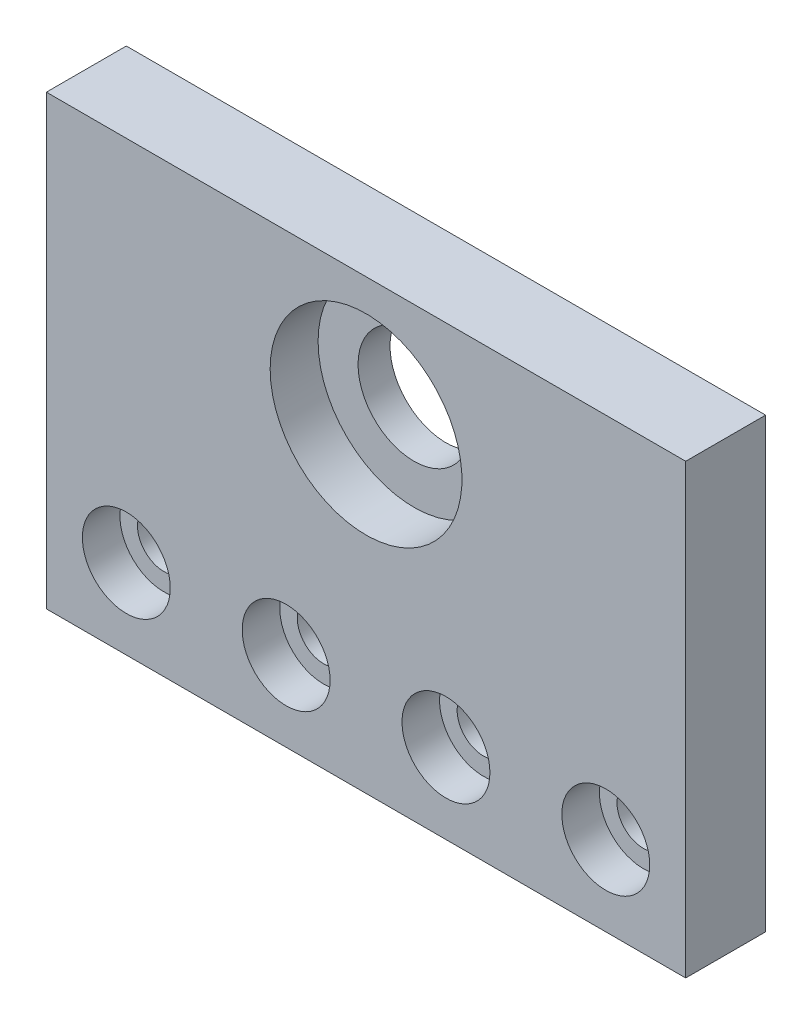
ISO-10303-21;
HEADER;
FILE_DESCRIPTION(('STEP AP214'),'2;1');
FILE_NAME('part.step','',(''),(''),'','','');
FILE_SCHEMA(('AUTOMOTIVE_DESIGN { 1 0 10303 214 1 1 1 1 }'));
ENDSEC;
DATA;
#1=APPLICATION_CONTEXT('core data for automotive mechanical design processes');
#2=APPLICATION_PROTOCOL_DEFINITION('international standard','automotive_design',2000,#1);
#3=PRODUCT_CONTEXT('',#1,'mechanical');
#4=PRODUCT('Part','Part','',(#3));
#5=PRODUCT_RELATED_PRODUCT_CATEGORY('part','',(#4));
#6=PRODUCT_DEFINITION_FORMATION('','',#4);
#7=PRODUCT_DEFINITION_CONTEXT('part definition',#1,'design');
#8=PRODUCT_DEFINITION('design','',#6,#7);
#9=PRODUCT_DEFINITION_SHAPE('','',#8);
#10=(LENGTH_UNIT() NAMED_UNIT(*) SI_UNIT(.MILLI.,.METRE.));
#11=(NAMED_UNIT(*) PLANE_ANGLE_UNIT() SI_UNIT($,.RADIAN.));
#12=(NAMED_UNIT(*) SI_UNIT($,.STERADIAN.) SOLID_ANGLE_UNIT());
#13=UNCERTAINTY_MEASURE_WITH_UNIT(LENGTH_MEASURE(1.E-05),#10,'distance_accuracy_value','');
#14=(GEOMETRIC_REPRESENTATION_CONTEXT(3) GLOBAL_UNCERTAINTY_ASSIGNED_CONTEXT((#13)) GLOBAL_UNIT_ASSIGNED_CONTEXT((#10,
#11,#12)) REPRESENTATION_CONTEXT('',''));
#15=CARTESIAN_POINT('',(0.,0.,0.));
#16=DIRECTION('',(0.,0.,1.));
#17=DIRECTION('',(1.,0.,0.));
#18=AXIS2_PLACEMENT_3D('',#15,#16,#17);
#19=CARTESIAN_POINT('',(0.,0.,0.));
#20=DIRECTION('',(0.,0.,-1.));
#21=DIRECTION('',(-1.,0.,0.));
#22=AXIS2_PLACEMENT_3D('',#19,#20,#21);
#23=PLANE('',#22);
#24=CARTESIAN_POINT('',(0.,0.,0.));
#25=DIRECTION('',(0.,0.,-1.));
#26=DIRECTION('',(-1.,0.,0.));
#27=AXIS2_PLACEMENT_3D('',#24,#25,#26);
#28=CIRCLE('',#27,12.);
#29=CARTESIAN_POINT('',(-12.,0.,0.));
#30=VERTEX_POINT('',#29);
#31=EDGE_CURVE('E231',#30,#30,#28,.T.);
#32=ORIENTED_EDGE('',*,*,#31,.T.);
#33=EDGE_LOOP('',(#32));
#34=FACE_BOUND('',#33,.T.);
#35=CARTESIAN_POINT('',(30.,-30.,0.));
#36=DIRECTION('',(0.,0.,1.));
#37=DIRECTION('',(1.,0.,0.));
#38=AXIS2_PLACEMENT_3D('',#35,#36,#37);
#39=CIRCLE('',#38,5.5);
#40=CARTESIAN_POINT('',(35.5,-30.,0.));
#41=VERTEX_POINT('',#40);
#42=EDGE_CURVE('E240',#41,#41,#39,.T.);
#43=ORIENTED_EDGE('',*,*,#42,.F.);
#44=EDGE_LOOP('',(#43));
#45=FACE_BOUND('',#44,.T.);
#46=CARTESIAN_POINT('',(10.,-30.,0.));
#47=DIRECTION('',(0.,0.,1.));
#48=DIRECTION('',(1.,0.,0.));
#49=AXIS2_PLACEMENT_3D('',#46,#47,#48);
#50=CIRCLE('',#49,5.5);
#51=CARTESIAN_POINT('',(15.5,-30.,0.));
#52=VERTEX_POINT('',#51);
#53=EDGE_CURVE('E252',#52,#52,#50,.T.);
#54=ORIENTED_EDGE('',*,*,#53,.F.);
#55=EDGE_LOOP('',(#54));
#56=FACE_BOUND('',#55,.T.);
#57=CARTESIAN_POINT('',(-9.99999999999999,-30.,0.));
#58=DIRECTION('',(0.,0.,1.));
#59=DIRECTION('',(1.,0.,0.));
#60=AXIS2_PLACEMENT_3D('',#57,#58,#59);
#61=CIRCLE('',#60,5.5);
#62=CARTESIAN_POINT('',(-4.5,-30.,0.));
#63=VERTEX_POINT('',#62);
#64=EDGE_CURVE('E264',#63,#63,#61,.T.);
#65=ORIENTED_EDGE('',*,*,#64,.F.);
#66=EDGE_LOOP('',(#65));
#67=FACE_BOUND('',#66,.T.);
#68=DIRECTION('',(0.,-1.,0.));
#69=VECTOR('',#68,1.);
#70=CARTESIAN_POINT('',(-40.,-40.,0.));
#71=LINE('',#70,#69);
#72=CARTESIAN_POINT('',(-40.,16.,0.));
#73=VERTEX_POINT('',#72);
#74=CARTESIAN_POINT('',(-40.,-40.,0.));
#75=VERTEX_POINT('',#74);
#76=EDGE_CURVE('E111',#73,#75,#71,.T.);
#77=ORIENTED_EDGE('',*,*,#76,.T.);
#78=DIRECTION('',(1.,0.,0.));
#79=VECTOR('',#78,1.);
#80=CARTESIAN_POINT('',(-40.,-40.,0.));
#81=LINE('',#80,#79);
#82=CARTESIAN_POINT('',(40.,-40.,0.));
#83=VERTEX_POINT('',#82);
#84=EDGE_CURVE('E114',#75,#83,#81,.T.);
#85=ORIENTED_EDGE('',*,*,#84,.T.);
#86=DIRECTION('',(0.,1.,0.));
#87=VECTOR('',#86,1.);
#88=CARTESIAN_POINT('',(40.,-40.,0.));
#89=LINE('',#88,#87);
#90=CARTESIAN_POINT('',(40.,16.,0.));
#91=VERTEX_POINT('',#90);
#92=EDGE_CURVE('E95',#83,#91,#89,.T.);
#93=ORIENTED_EDGE('',*,*,#92,.T.);
#94=DIRECTION('',(-1.,0.,0.));
#95=VECTOR('',#94,1.);
#96=CARTESIAN_POINT('',(-40.,16.,0.));
#97=LINE('',#96,#95);
#98=EDGE_CURVE('E106',#91,#73,#97,.T.);
#99=ORIENTED_EDGE('',*,*,#98,.T.);
#100=EDGE_LOOP('',(#77,#85,#93,#99));
#101=FACE_BOUND('',#100,.T.);
#102=CARTESIAN_POINT('',(-30.,-30.,0.));
#103=DIRECTION('',(0.,0.,1.));
#104=DIRECTION('',(1.,0.,0.));
#105=AXIS2_PLACEMENT_3D('',#102,#103,#104);
#106=CIRCLE('',#105,5.5);
#107=CARTESIAN_POINT('',(-24.5,-30.,0.));
#108=VERTEX_POINT('',#107);
#109=EDGE_CURVE('E276',#108,#108,#106,.T.);
#110=ORIENTED_EDGE('',*,*,#109,.F.);
#111=EDGE_LOOP('',(#110));
#112=FACE_BOUND('',#111,.T.);
#113=ADVANCED_FACE('F43',(#34,#45,#56,#67,#101,#112),#23,.F.);
#114=CARTESIAN_POINT('',(-40.,-40.,-10.));
#115=DIRECTION('',(-1.,0.,0.));
#116=DIRECTION('',(0.,0.,1.));
#117=AXIS2_PLACEMENT_3D('',#114,#115,#116);
#118=PLANE('',#117);
#119=ORIENTED_EDGE('',*,*,#76,.F.);
#120=DIRECTION('',(0.,0.,1.));
#121=VECTOR('',#120,1.);
#122=CARTESIAN_POINT('',(-40.,16.,-10.));
#123=LINE('',#122,#121);
#124=CARTESIAN_POINT('',(-40.,16.,-10.));
#125=VERTEX_POINT('',#124);
#126=EDGE_CURVE('E11',#125,#73,#123,.T.);
#127=ORIENTED_EDGE('',*,*,#126,.F.);
#128=DIRECTION('',(0.,-1.,0.));
#129=VECTOR('',#128,1.);
#130=CARTESIAN_POINT('',(-40.,-40.,-10.));
#131=LINE('',#130,#129);
#132=CARTESIAN_POINT('',(-40.,-40.,-10.));
#133=VERTEX_POINT('',#132);
#134=EDGE_CURVE('E104',#125,#133,#131,.T.);
#135=ORIENTED_EDGE('',*,*,#134,.T.);
#136=DIRECTION('',(0.,0.,1.));
#137=VECTOR('',#136,1.);
#138=CARTESIAN_POINT('',(-40.,-40.,-10.));
#139=LINE('',#138,#137);
#140=EDGE_CURVE('E87',#133,#75,#139,.T.);
#141=ORIENTED_EDGE('',*,*,#140,.T.);
#142=EDGE_LOOP('',(#119,#127,#135,#141));
#143=FACE_BOUND('',#142,.T.);
#144=ADVANCED_FACE('F45',(#143),#118,.T.);
#145=CARTESIAN_POINT('',(-40.,16.,-10.));
#146=DIRECTION('',(0.,1.,0.));
#147=DIRECTION('',(0.,0.,1.));
#148=AXIS2_PLACEMENT_3D('',#145,#146,#147);
#149=PLANE('',#148);
#150=ORIENTED_EDGE('',*,*,#98,.F.);
#151=DIRECTION('',(0.,0.,1.));
#152=VECTOR('',#151,1.);
#153=CARTESIAN_POINT('',(40.,16.,-10.));
#154=LINE('',#153,#152);
#155=CARTESIAN_POINT('',(40.,16.,-10.));
#156=VERTEX_POINT('',#155);
#157=EDGE_CURVE('E53',#156,#91,#154,.T.);
#158=ORIENTED_EDGE('',*,*,#157,.F.);
#159=DIRECTION('',(-1.,0.,0.));
#160=VECTOR('',#159,1.);
#161=CARTESIAN_POINT('',(-40.,16.,-10.));
#162=LINE('',#161,#160);
#163=EDGE_CURVE('E101',#156,#125,#162,.T.);
#164=ORIENTED_EDGE('',*,*,#163,.T.);
#165=ORIENTED_EDGE('',*,*,#126,.T.);
#166=EDGE_LOOP('',(#150,#158,#164,#165));
#167=FACE_BOUND('',#166,.T.);
#168=ADVANCED_FACE('F122',(#167),#149,.T.);
#169=CARTESIAN_POINT('',(40.,-40.,-10.));
#170=DIRECTION('',(1.,0.,0.));
#171=DIRECTION('',(0.,0.,-1.));
#172=AXIS2_PLACEMENT_3D('',#169,#170,#171);
#173=PLANE('',#172);
#174=ORIENTED_EDGE('',*,*,#92,.F.);
#175=DIRECTION('',(0.,0.,1.));
#176=VECTOR('',#175,1.);
#177=CARTESIAN_POINT('',(40.,-40.,-10.));
#178=LINE('',#177,#176);
#179=CARTESIAN_POINT('',(40.,-40.,-10.));
#180=VERTEX_POINT('',#179);
#181=EDGE_CURVE('E90',#180,#83,#178,.T.);
#182=ORIENTED_EDGE('',*,*,#181,.F.);
#183=DIRECTION('',(0.,1.,0.));
#184=VECTOR('',#183,1.);
#185=CARTESIAN_POINT('',(40.,-40.,-10.));
#186=LINE('',#185,#184);
#187=EDGE_CURVE('E93',#180,#156,#186,.T.);
#188=ORIENTED_EDGE('',*,*,#187,.T.);
#189=ORIENTED_EDGE('',*,*,#157,.T.);
#190=EDGE_LOOP('',(#174,#182,#188,#189));
#191=FACE_BOUND('',#190,.T.);
#192=ADVANCED_FACE('F92',(#191),#173,.T.);
#193=CARTESIAN_POINT('',(-40.,-40.,-10.));
#194=DIRECTION('',(0.,-1.,0.));
#195=DIRECTION('',(0.,0.,-1.));
#196=AXIS2_PLACEMENT_3D('',#193,#194,#195);
#197=PLANE('',#196);
#198=ORIENTED_EDGE('',*,*,#84,.F.);
#199=ORIENTED_EDGE('',*,*,#140,.F.);
#200=DIRECTION('',(1.,0.,0.));
#201=VECTOR('',#200,1.);
#202=CARTESIAN_POINT('',(-40.,-40.,-10.));
#203=LINE('',#202,#201);
#204=EDGE_CURVE('E100',#133,#180,#203,.T.);
#205=ORIENTED_EDGE('',*,*,#204,.T.);
#206=ORIENTED_EDGE('',*,*,#181,.T.);
#207=EDGE_LOOP('',(#198,#199,#205,#206));
#208=FACE_BOUND('',#207,.T.);
#209=ADVANCED_FACE('F103',(#208),#197,.T.);
#210=CARTESIAN_POINT('',(0.,0.,-10.));
#211=DIRECTION('',(0.,0.,-1.));
#212=DIRECTION('',(-1.,0.,0.));
#213=AXIS2_PLACEMENT_3D('',#210,#211,#212);
#214=PLANE('',#213);
#215=CARTESIAN_POINT('',(30.,0.,-10.));
#216=DIRECTION('',(0.,0.,1.));
#217=DIRECTION('',(1.,0.,0.));
#218=AXIS2_PLACEMENT_3D('',#215,#216,#217);
#219=CIRCLE('',#218,5.);
#220=CARTESIAN_POINT('',(35.,0.,-10.));
#221=VERTEX_POINT('',#220);
#222=EDGE_CURVE('E222',#221,#221,#219,.T.);
#223=ORIENTED_EDGE('',*,*,#222,.T.);
#224=EDGE_LOOP('',(#223));
#225=FACE_BOUND('',#224,.T.);
#226=CARTESIAN_POINT('',(-30.,0.,-10.));
#227=DIRECTION('',(0.,0.,-1.));
#228=DIRECTION('',(-1.,0.,0.));
#229=AXIS2_PLACEMENT_3D('',#226,#227,#228);
#230=CIRCLE('',#229,5.);
#231=CARTESIAN_POINT('',(-35.,0.,-10.));
#232=VERTEX_POINT('',#231);
#233=EDGE_CURVE('E221',#232,#232,#230,.T.);
#234=ORIENTED_EDGE('',*,*,#233,.F.);
#235=EDGE_LOOP('',(#234));
#236=FACE_BOUND('',#235,.T.);
#237=CARTESIAN_POINT('',(0.,0.,-10.));
#238=DIRECTION('',(0.,0.,1.));
#239=DIRECTION('',(1.,0.,0.));
#240=AXIS2_PLACEMENT_3D('',#237,#238,#239);
#241=CIRCLE('',#240,7.);
#242=CARTESIAN_POINT('',(7.,0.,-10.));
#243=VERTEX_POINT('',#242);
#244=EDGE_CURVE('E237',#243,#243,#241,.T.);
#245=ORIENTED_EDGE('',*,*,#244,.T.);
#246=EDGE_LOOP('',(#245));
#247=FACE_BOUND('',#246,.T.);
#248=CARTESIAN_POINT('',(30.,-30.,-10.));
#249=DIRECTION('',(0.,0.,1.));
#250=DIRECTION('',(1.,0.,0.));
#251=AXIS2_PLACEMENT_3D('',#248,#249,#250);
#252=CIRCLE('',#251,3.3);
#253=CARTESIAN_POINT('',(33.3,-30.,-10.));
#254=VERTEX_POINT('',#253);
#255=EDGE_CURVE('E249',#254,#254,#252,.T.);
#256=ORIENTED_EDGE('',*,*,#255,.T.);
#257=EDGE_LOOP('',(#256));
#258=FACE_BOUND('',#257,.T.);
#259=CARTESIAN_POINT('',(10.,-30.,-10.));
#260=DIRECTION('',(0.,0.,1.));
#261=DIRECTION('',(1.,0.,0.));
#262=AXIS2_PLACEMENT_3D('',#259,#260,#261);
#263=CIRCLE('',#262,3.3);
#264=CARTESIAN_POINT('',(13.3,-30.,-10.));
#265=VERTEX_POINT('',#264);
#266=EDGE_CURVE('E261',#265,#265,#263,.T.);
#267=ORIENTED_EDGE('',*,*,#266,.T.);
#268=EDGE_LOOP('',(#267));
#269=FACE_BOUND('',#268,.T.);
#270=CARTESIAN_POINT('',(-9.99999999999999,-30.,-10.));
#271=DIRECTION('',(0.,0.,1.));
#272=DIRECTION('',(1.,0.,0.));
#273=AXIS2_PLACEMENT_3D('',#270,#271,#272);
#274=CIRCLE('',#273,3.3);
#275=CARTESIAN_POINT('',(-6.7,-30.,-10.));
#276=VERTEX_POINT('',#275);
#277=EDGE_CURVE('E273',#276,#276,#274,.T.);
#278=ORIENTED_EDGE('',*,*,#277,.T.);
#279=EDGE_LOOP('',(#278));
#280=FACE_BOUND('',#279,.T.);
#281=CARTESIAN_POINT('',(-30.,-30.,-10.));
#282=DIRECTION('',(0.,0.,1.));
#283=DIRECTION('',(1.,0.,0.));
#284=AXIS2_PLACEMENT_3D('',#281,#282,#283);
#285=CIRCLE('',#284,3.3);
#286=CARTESIAN_POINT('',(-26.7,-30.,-10.));
#287=VERTEX_POINT('',#286);
#288=EDGE_CURVE('E115',#287,#287,#285,.T.);
#289=ORIENTED_EDGE('',*,*,#288,.T.);
#290=EDGE_LOOP('',(#289));
#291=FACE_BOUND('',#290,.T.);
#292=ORIENTED_EDGE('',*,*,#134,.F.);
#293=ORIENTED_EDGE('',*,*,#163,.F.);
#294=ORIENTED_EDGE('',*,*,#187,.F.);
#295=ORIENTED_EDGE('',*,*,#204,.F.);
#296=EDGE_LOOP('',(#292,#293,#294,#295));
#297=FACE_BOUND('',#296,.T.);
#298=ADVANCED_FACE('F99',(#225,#236,#247,#258,#269,#280,#291,#297),#214,.T.);
#299=CARTESIAN_POINT('',(-30.,-30.,0.));
#300=DIRECTION('',(0.,0.,1.));
#301=DIRECTION('',(1.,0.,0.));
#302=AXIS2_PLACEMENT_3D('',#299,#300,#301);
#303=CYLINDRICAL_SURFACE('',#302,3.3);
#304=ORIENTED_EDGE('',*,*,#288,.F.);
#305=EDGE_LOOP('',(#304));
#306=FACE_BOUND('',#305,.T.);
#307=CARTESIAN_POINT('',(-30.,-30.,-4.7));
#308=DIRECTION('',(0.,0.,1.));
#309=DIRECTION('',(1.,0.,0.));
#310=AXIS2_PLACEMENT_3D('',#307,#308,#309);
#311=CIRCLE('',#310,3.3);
#312=CARTESIAN_POINT('',(-26.7,-30.,-4.7));
#313=VERTEX_POINT('',#312);
#314=EDGE_CURVE('E282',#313,#313,#311,.T.);
#315=ORIENTED_EDGE('',*,*,#314,.T.);
#316=EDGE_LOOP('',(#315));
#317=FACE_BOUND('',#316,.T.);
#318=ADVANCED_FACE('F142',(#306,#317),#303,.F.);
#319=CARTESIAN_POINT('',(-26.7,-30.,-4.7));
#320=DIRECTION('',(0.,0.,-1.));
#321=DIRECTION('',(-1.,0.,0.));
#322=AXIS2_PLACEMENT_3D('',#319,#320,#321);
#323=PLANE('',#322);
#324=ORIENTED_EDGE('',*,*,#314,.F.);
#325=EDGE_LOOP('',(#324));
#326=FACE_BOUND('',#325,.T.);
#327=CARTESIAN_POINT('',(-30.,-30.,-4.7));
#328=DIRECTION('',(0.,0.,1.));
#329=DIRECTION('',(1.,0.,0.));
#330=AXIS2_PLACEMENT_3D('',#327,#328,#329);
#331=CIRCLE('',#330,5.5);
#332=CARTESIAN_POINT('',(-24.5,-30.,-4.7));
#333=VERTEX_POINT('',#332);
#334=EDGE_CURVE('E279',#333,#333,#331,.T.);
#335=ORIENTED_EDGE('',*,*,#334,.T.);
#336=EDGE_LOOP('',(#335));
#337=FACE_BOUND('',#336,.T.);
#338=ADVANCED_FACE('F146',(#326,#337),#323,.F.);
#339=CARTESIAN_POINT('',(-30.,-30.,0.));
#340=DIRECTION('',(0.,0.,1.));
#341=DIRECTION('',(1.,0.,0.));
#342=AXIS2_PLACEMENT_3D('',#339,#340,#341);
#343=CYLINDRICAL_SURFACE('',#342,5.5);
#344=ORIENTED_EDGE('',*,*,#334,.F.);
#345=EDGE_LOOP('',(#344));
#346=FACE_BOUND('',#345,.T.);
#347=ORIENTED_EDGE('',*,*,#109,.T.);
#348=EDGE_LOOP('',(#347));
#349=FACE_BOUND('',#348,.T.);
#350=ADVANCED_FACE('F150',(#346,#349),#343,.F.);
#351=CARTESIAN_POINT('',(-9.99999999999999,-30.,0.));
#352=DIRECTION('',(0.,0.,1.));
#353=DIRECTION('',(1.,0.,0.));
#354=AXIS2_PLACEMENT_3D('',#351,#352,#353);
#355=CYLINDRICAL_SURFACE('',#354,3.3);
#356=ORIENTED_EDGE('',*,*,#277,.F.);
#357=EDGE_LOOP('',(#356));
#358=FACE_BOUND('',#357,.T.);
#359=CARTESIAN_POINT('',(-9.99999999999999,-30.,-4.7));
#360=DIRECTION('',(0.,0.,1.));
#361=DIRECTION('',(1.,0.,0.));
#362=AXIS2_PLACEMENT_3D('',#359,#360,#361);
#363=CIRCLE('',#362,3.3);
#364=CARTESIAN_POINT('',(-6.69999999999999,-30.,-4.7));
#365=VERTEX_POINT('',#364);
#366=EDGE_CURVE('E270',#365,#365,#363,.T.);
#367=ORIENTED_EDGE('',*,*,#366,.T.);
#368=EDGE_LOOP('',(#367));
#369=FACE_BOUND('',#368,.T.);
#370=ADVANCED_FACE('F154',(#358,#369),#355,.F.);
#371=CARTESIAN_POINT('',(-6.69999999999999,-30.,-4.7));
#372=DIRECTION('',(0.,0.,-1.));
#373=DIRECTION('',(-1.,0.,0.));
#374=AXIS2_PLACEMENT_3D('',#371,#372,#373);
#375=PLANE('',#374);
#376=ORIENTED_EDGE('',*,*,#366,.F.);
#377=EDGE_LOOP('',(#376));
#378=FACE_BOUND('',#377,.T.);
#379=CARTESIAN_POINT('',(-9.99999999999999,-30.,-4.7));
#380=DIRECTION('',(0.,0.,1.));
#381=DIRECTION('',(1.,0.,0.));
#382=AXIS2_PLACEMENT_3D('',#379,#380,#381);
#383=CIRCLE('',#382,5.5);
#384=CARTESIAN_POINT('',(-4.5,-30.,-4.7));
#385=VERTEX_POINT('',#384);
#386=EDGE_CURVE('E267',#385,#385,#383,.T.);
#387=ORIENTED_EDGE('',*,*,#386,.T.);
#388=EDGE_LOOP('',(#387));
#389=FACE_BOUND('',#388,.T.);
#390=ADVANCED_FACE('F158',(#378,#389),#375,.F.);
#391=CARTESIAN_POINT('',(-9.99999999999999,-30.,0.));
#392=DIRECTION('',(0.,0.,1.));
#393=DIRECTION('',(1.,0.,0.));
#394=AXIS2_PLACEMENT_3D('',#391,#392,#393);
#395=CYLINDRICAL_SURFACE('',#394,5.5);
#396=ORIENTED_EDGE('',*,*,#386,.F.);
#397=EDGE_LOOP('',(#396));
#398=FACE_BOUND('',#397,.T.);
#399=ORIENTED_EDGE('',*,*,#64,.T.);
#400=EDGE_LOOP('',(#399));
#401=FACE_BOUND('',#400,.T.);
#402=ADVANCED_FACE('F162',(#398,#401),#395,.F.);
#403=CARTESIAN_POINT('',(10.,-30.,0.));
#404=DIRECTION('',(0.,0.,1.));
#405=DIRECTION('',(1.,0.,0.));
#406=AXIS2_PLACEMENT_3D('',#403,#404,#405);
#407=CYLINDRICAL_SURFACE('',#406,3.3);
#408=ORIENTED_EDGE('',*,*,#266,.F.);
#409=EDGE_LOOP('',(#408));
#410=FACE_BOUND('',#409,.T.);
#411=CARTESIAN_POINT('',(10.,-30.,-4.7));
#412=DIRECTION('',(0.,0.,1.));
#413=DIRECTION('',(1.,0.,0.));
#414=AXIS2_PLACEMENT_3D('',#411,#412,#413);
#415=CIRCLE('',#414,3.3);
#416=CARTESIAN_POINT('',(13.3,-30.,-4.7));
#417=VERTEX_POINT('',#416);
#418=EDGE_CURVE('E258',#417,#417,#415,.T.);
#419=ORIENTED_EDGE('',*,*,#418,.T.);
#420=EDGE_LOOP('',(#419));
#421=FACE_BOUND('',#420,.T.);
#422=ADVANCED_FACE('F166',(#410,#421),#407,.F.);
#423=CARTESIAN_POINT('',(13.3,-30.,-4.7));
#424=DIRECTION('',(0.,0.,-1.));
#425=DIRECTION('',(-1.,0.,0.));
#426=AXIS2_PLACEMENT_3D('',#423,#424,#425);
#427=PLANE('',#426);
#428=ORIENTED_EDGE('',*,*,#418,.F.);
#429=EDGE_LOOP('',(#428));
#430=FACE_BOUND('',#429,.T.);
#431=CARTESIAN_POINT('',(10.,-30.,-4.7));
#432=DIRECTION('',(0.,0.,1.));
#433=DIRECTION('',(1.,0.,0.));
#434=AXIS2_PLACEMENT_3D('',#431,#432,#433);
#435=CIRCLE('',#434,5.5);
#436=CARTESIAN_POINT('',(15.5,-30.,-4.7));
#437=VERTEX_POINT('',#436);
#438=EDGE_CURVE('E255',#437,#437,#435,.T.);
#439=ORIENTED_EDGE('',*,*,#438,.T.);
#440=EDGE_LOOP('',(#439));
#441=FACE_BOUND('',#440,.T.);
#442=ADVANCED_FACE('F170',(#430,#441),#427,.F.);
#443=CARTESIAN_POINT('',(10.,-30.,0.));
#444=DIRECTION('',(0.,0.,1.));
#445=DIRECTION('',(1.,0.,0.));
#446=AXIS2_PLACEMENT_3D('',#443,#444,#445);
#447=CYLINDRICAL_SURFACE('',#446,5.5);
#448=ORIENTED_EDGE('',*,*,#438,.F.);
#449=EDGE_LOOP('',(#448));
#450=FACE_BOUND('',#449,.T.);
#451=ORIENTED_EDGE('',*,*,#53,.T.);
#452=EDGE_LOOP('',(#451));
#453=FACE_BOUND('',#452,.T.);
#454=ADVANCED_FACE('F174',(#450,#453),#447,.F.);
#455=CARTESIAN_POINT('',(30.,-30.,0.));
#456=DIRECTION('',(0.,0.,1.));
#457=DIRECTION('',(1.,0.,0.));
#458=AXIS2_PLACEMENT_3D('',#455,#456,#457);
#459=CYLINDRICAL_SURFACE('',#458,3.3);
#460=ORIENTED_EDGE('',*,*,#255,.F.);
#461=EDGE_LOOP('',(#460));
#462=FACE_BOUND('',#461,.T.);
#463=CARTESIAN_POINT('',(30.,-30.,-4.7));
#464=DIRECTION('',(0.,0.,1.));
#465=DIRECTION('',(1.,0.,0.));
#466=AXIS2_PLACEMENT_3D('',#463,#464,#465);
#467=CIRCLE('',#466,3.3);
#468=CARTESIAN_POINT('',(33.3,-30.,-4.7));
#469=VERTEX_POINT('',#468);
#470=EDGE_CURVE('E246',#469,#469,#467,.T.);
#471=ORIENTED_EDGE('',*,*,#470,.T.);
#472=EDGE_LOOP('',(#471));
#473=FACE_BOUND('',#472,.T.);
#474=ADVANCED_FACE('F178',(#462,#473),#459,.F.);
#475=CARTESIAN_POINT('',(33.3,-30.,-4.7));
#476=DIRECTION('',(0.,0.,-1.));
#477=DIRECTION('',(-1.,0.,0.));
#478=AXIS2_PLACEMENT_3D('',#475,#476,#477);
#479=PLANE('',#478);
#480=ORIENTED_EDGE('',*,*,#470,.F.);
#481=EDGE_LOOP('',(#480));
#482=FACE_BOUND('',#481,.T.);
#483=CARTESIAN_POINT('',(30.,-30.,-4.7));
#484=DIRECTION('',(0.,0.,1.));
#485=DIRECTION('',(1.,0.,0.));
#486=AXIS2_PLACEMENT_3D('',#483,#484,#485);
#487=CIRCLE('',#486,5.5);
#488=CARTESIAN_POINT('',(35.5,-30.,-4.7));
#489=VERTEX_POINT('',#488);
#490=EDGE_CURVE('E243',#489,#489,#487,.T.);
#491=ORIENTED_EDGE('',*,*,#490,.T.);
#492=EDGE_LOOP('',(#491));
#493=FACE_BOUND('',#492,.T.);
#494=ADVANCED_FACE('F182',(#482,#493),#479,.F.);
#495=CARTESIAN_POINT('',(30.,-30.,0.));
#496=DIRECTION('',(0.,0.,1.));
#497=DIRECTION('',(1.,0.,0.));
#498=AXIS2_PLACEMENT_3D('',#495,#496,#497);
#499=CYLINDRICAL_SURFACE('',#498,5.5);
#500=ORIENTED_EDGE('',*,*,#490,.F.);
#501=EDGE_LOOP('',(#500));
#502=FACE_BOUND('',#501,.T.);
#503=ORIENTED_EDGE('',*,*,#42,.T.);
#504=EDGE_LOOP('',(#503));
#505=FACE_BOUND('',#504,.T.);
#506=ADVANCED_FACE('F186',(#502,#505),#499,.F.);
#507=CARTESIAN_POINT('',(0.,0.,-10.));
#508=DIRECTION('',(0.,0.,1.));
#509=DIRECTION('',(1.,0.,0.));
#510=AXIS2_PLACEMENT_3D('',#507,#508,#509);
#511=CYLINDRICAL_SURFACE('',#510,7.);
#512=CARTESIAN_POINT('',(0.,0.,-6.));
#513=DIRECTION('',(0.,0.,-1.));
#514=DIRECTION('',(-1.,0.,0.));
#515=AXIS2_PLACEMENT_3D('',#512,#513,#514);
#516=CIRCLE('',#515,7.);
#517=CARTESIAN_POINT('',(-7.,0.,-6.));
#518=VERTEX_POINT('',#517);
#519=EDGE_CURVE('E47',#518,#518,#516,.F.);
#520=ORIENTED_EDGE('',*,*,#519,.T.);
#521=EDGE_LOOP('',(#520));
#522=FACE_BOUND('',#521,.T.);
#523=ORIENTED_EDGE('',*,*,#244,.F.);
#524=EDGE_LOOP('',(#523));
#525=FACE_BOUND('',#524,.T.);
#526=ADVANCED_FACE('F189',(#522,#525),#511,.F.);
#527=CARTESIAN_POINT('',(0.,0.,-6.));
#528=DIRECTION('',(0.,0.,-1.));
#529=DIRECTION('',(-1.,0.,0.));
#530=AXIS2_PLACEMENT_3D('',#527,#528,#529);
#531=PLANE('',#530);
#532=CARTESIAN_POINT('',(0.,0.,-6.));
#533=DIRECTION('',(0.,0.,-1.));
#534=DIRECTION('',(-1.,0.,0.));
#535=AXIS2_PLACEMENT_3D('',#532,#533,#534);
#536=CIRCLE('',#535,12.);
#537=CARTESIAN_POINT('',(-12.,0.,-6.));
#538=VERTEX_POINT('',#537);
#539=EDGE_CURVE('E233',#538,#538,#536,.T.);
#540=ORIENTED_EDGE('',*,*,#539,.F.);
#541=EDGE_LOOP('',(#540));
#542=FACE_BOUND('',#541,.T.);
#543=ORIENTED_EDGE('',*,*,#519,.F.);
#544=EDGE_LOOP('',(#543));
#545=FACE_BOUND('',#544,.T.);
#546=ADVANCED_FACE('F192',(#542,#545),#531,.F.);
#547=CARTESIAN_POINT('',(0.,0.,-6.));
#548=DIRECTION('',(0.,0.,1.));
#549=DIRECTION('',(1.,0.,0.));
#550=AXIS2_PLACEMENT_3D('',#547,#548,#549);
#551=CYLINDRICAL_SURFACE('',#550,12.);
#552=ORIENTED_EDGE('',*,*,#539,.T.);
#553=EDGE_LOOP('',(#552));
#554=FACE_BOUND('',#553,.T.);
#555=ORIENTED_EDGE('',*,*,#31,.F.);
#556=EDGE_LOOP('',(#555));
#557=FACE_BOUND('',#556,.T.);
#558=ADVANCED_FACE('F194',(#554,#557),#551,.F.);
#559=CARTESIAN_POINT('',(-30.,0.,-5.));
#560=DIRECTION('',(0.,0.,-1.));
#561=DIRECTION('',(-1.,0.,0.));
#562=AXIS2_PLACEMENT_3D('',#559,#560,#561);
#563=CYLINDRICAL_SURFACE('',#562,5.);
#564=CARTESIAN_POINT('',(-30.,0.,-5.));
#565=DIRECTION('',(0.,0.,-1.));
#566=DIRECTION('',(-1.,0.,0.));
#567=AXIS2_PLACEMENT_3D('',#564,#565,#566);
#568=CIRCLE('',#567,5.);
#569=CARTESIAN_POINT('',(-35.,0.,-5.));
#570=VERTEX_POINT('',#569);
#571=EDGE_CURVE('E225',#570,#570,#568,.T.);
#572=ORIENTED_EDGE('',*,*,#571,.F.);
#573=EDGE_LOOP('',(#572));
#574=FACE_BOUND('',#573,.T.);
#575=ORIENTED_EDGE('',*,*,#233,.T.);
#576=EDGE_LOOP('',(#575));
#577=FACE_BOUND('',#576,.T.);
#578=ADVANCED_FACE('F197',(#574,#577),#563,.F.);
#579=CARTESIAN_POINT('',(-30.,0.,-5.));
#580=DIRECTION('',(0.,0.,-1.));
#581=DIRECTION('',(-1.,0.,0.));
#582=AXIS2_PLACEMENT_3D('',#579,#580,#581);
#583=PLANE('',#582);
#584=ORIENTED_EDGE('',*,*,#571,.T.);
#585=EDGE_LOOP('',(#584));
#586=FACE_BOUND('',#585,.T.);
#587=ADVANCED_FACE('F204',(#586),#583,.T.);
#588=CARTESIAN_POINT('',(30.,0.,-5.));
#589=DIRECTION('',(0.,0.,-1.));
#590=DIRECTION('',(-1.,0.,0.));
#591=AXIS2_PLACEMENT_3D('',#588,#589,#590);
#592=CYLINDRICAL_SURFACE('',#591,5.);
#593=CARTESIAN_POINT('',(30.,0.,-5.));
#594=DIRECTION('',(0.,0.,1.));
#595=DIRECTION('',(1.,0.,0.));
#596=AXIS2_PLACEMENT_3D('',#593,#594,#595);
#597=CIRCLE('',#596,5.);
#598=CARTESIAN_POINT('',(35.,0.,-5.));
#599=VERTEX_POINT('',#598);
#600=EDGE_CURVE('E220',#599,#599,#597,.T.);
#601=ORIENTED_EDGE('',*,*,#600,.T.);
#602=EDGE_LOOP('',(#601));
#603=FACE_BOUND('',#602,.T.);
#604=ORIENTED_EDGE('',*,*,#222,.F.);
#605=EDGE_LOOP('',(#604));
#606=FACE_BOUND('',#605,.T.);
#607=ADVANCED_FACE('F208',(#603,#606),#592,.F.);
#608=CARTESIAN_POINT('',(30.,0.,-5.));
#609=DIRECTION('',(0.,0.,-1.));
#610=DIRECTION('',(1.,0.,0.));
#611=AXIS2_PLACEMENT_3D('',#608,#609,#610);
#612=PLANE('',#611);
#613=ORIENTED_EDGE('',*,*,#600,.F.);
#614=EDGE_LOOP('',(#613));
#615=FACE_BOUND('',#614,.T.);
#616=ADVANCED_FACE('F212',(#615),#612,.T.);
#617=CLOSED_SHELL('',(#113,#144,#168,#192,#209,#298,#318,#338,#350,#370,#390,#402,#422,#442,
#454,#474,#494,#506,#526,#546,#558,#578,#587,#607,#616));
#618=MANIFOLD_SOLID_BREP('B2',#617);
#619=ADVANCED_BREP_SHAPE_REPRESENTATION('',(#18,#618),#14);
#620=SHAPE_DEFINITION_REPRESENTATION(#9,#619);
ENDSEC;
END-ISO-10303-21;
